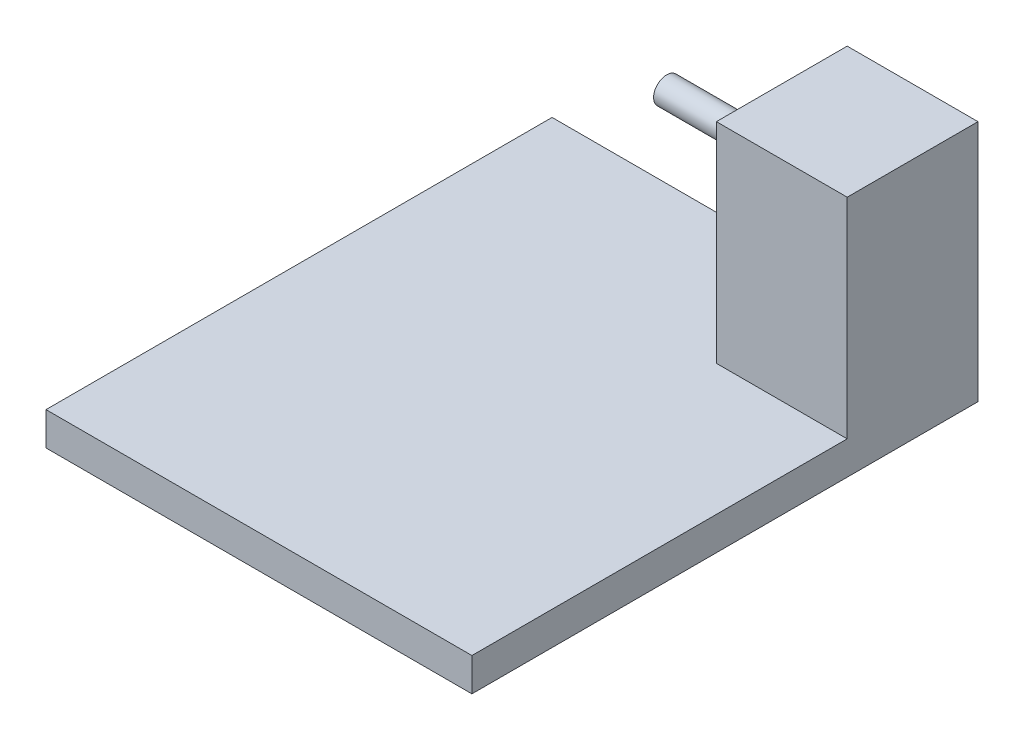
ISO-10303-21;
HEADER;
FILE_DESCRIPTION(('STEP AP214'),'2;1');
FILE_NAME('part.step','',(''),(''),'','','');
FILE_SCHEMA(('AUTOMOTIVE_DESIGN { 1 0 10303 214 1 1 1 1 }'));
ENDSEC;
DATA;
#1=APPLICATION_CONTEXT('core data for automotive mechanical design processes');
#2=APPLICATION_PROTOCOL_DEFINITION('international standard','automotive_design',2000,#1);
#3=PRODUCT_CONTEXT('',#1,'mechanical');
#4=PRODUCT('Part','Part','',(#3));
#5=PRODUCT_RELATED_PRODUCT_CATEGORY('part','',(#4));
#6=PRODUCT_DEFINITION_FORMATION('','',#4);
#7=PRODUCT_DEFINITION_CONTEXT('part definition',#1,'design');
#8=PRODUCT_DEFINITION('design','',#6,#7);
#9=PRODUCT_DEFINITION_SHAPE('','',#8);
#10=(LENGTH_UNIT() NAMED_UNIT(*) SI_UNIT(.MILLI.,.METRE.));
#11=(NAMED_UNIT(*) PLANE_ANGLE_UNIT() SI_UNIT($,.RADIAN.));
#12=(NAMED_UNIT(*) SI_UNIT($,.STERADIAN.) SOLID_ANGLE_UNIT());
#13=UNCERTAINTY_MEASURE_WITH_UNIT(LENGTH_MEASURE(1.E-05),#10,'distance_accuracy_value','');
#14=(GEOMETRIC_REPRESENTATION_CONTEXT(3) GLOBAL_UNCERTAINTY_ASSIGNED_CONTEXT((#13)) GLOBAL_UNIT_ASSIGNED_CONTEXT((#10,
#11,#12)) REPRESENTATION_CONTEXT('',''));
#15=CARTESIAN_POINT('',(0.,0.,0.));
#16=DIRECTION('',(0.,0.,1.));
#17=DIRECTION('',(1.,0.,0.));
#18=AXIS2_PLACEMENT_3D('',#15,#16,#17);
#19=CARTESIAN_POINT('',(40.7,6.35,-48.36));
#20=DIRECTION('',(-1.,0.,0.));
#21=DIRECTION('',(0.,0.,1.));
#22=AXIS2_PLACEMENT_3D('',#19,#20,#21);
#23=PLANE('',#22);
#24=DIRECTION('',(0.,0.,-1.));
#25=VECTOR('',#24,1.);
#26=CARTESIAN_POINT('',(40.7,0.,-48.36));
#27=LINE('',#26,#25);
#28=CARTESIAN_POINT('',(40.7,0.,48.36));
#29=VERTEX_POINT('',#28);
#30=CARTESIAN_POINT('',(40.7,0.,-48.36));
#31=VERTEX_POINT('',#30);
#32=EDGE_CURVE('E114',#29,#31,#27,.T.);
#33=ORIENTED_EDGE('',*,*,#32,.T.);
#34=DIRECTION('',(0.,-1.,0.));
#35=VECTOR('',#34,1.);
#36=CARTESIAN_POINT('',(40.7,6.35,-48.36));
#37=LINE('',#36,#35);
#38=CARTESIAN_POINT('',(40.7,46.35,-48.36));
#39=VERTEX_POINT('',#38);
#40=EDGE_CURVE('E40',#39,#31,#37,.T.);
#41=ORIENTED_EDGE('',*,*,#40,.F.);
#42=DIRECTION('',(0.,0.,-1.));
#43=VECTOR('',#42,1.);
#44=CARTESIAN_POINT('',(40.7,46.35,-48.36));
#45=LINE('',#44,#43);
#46=CARTESIAN_POINT('',(40.7,46.35,-23.36));
#47=VERTEX_POINT('',#46);
#48=EDGE_CURVE('E106',#47,#39,#45,.T.);
#49=ORIENTED_EDGE('',*,*,#48,.F.);
#50=DIRECTION('',(0.,-1.,0.));
#51=VECTOR('',#50,1.);
#52=CARTESIAN_POINT('',(40.7,46.35,-23.36));
#53=LINE('',#52,#51);
#54=CARTESIAN_POINT('',(40.7,6.35,-23.36));
#55=VERTEX_POINT('',#54);
#56=EDGE_CURVE('E119',#47,#55,#53,.T.);
#57=ORIENTED_EDGE('',*,*,#56,.T.);
#58=DIRECTION('',(0.,0.,-1.));
#59=VECTOR('',#58,1.);
#60=CARTESIAN_POINT('',(40.7,6.35,-48.36));
#61=LINE('',#60,#59);
#62=CARTESIAN_POINT('',(40.7,6.35,48.36));
#63=VERTEX_POINT('',#62);
#64=EDGE_CURVE('E53',#63,#55,#61,.T.);
#65=ORIENTED_EDGE('',*,*,#64,.F.);
#66=DIRECTION('',(0.,-1.,0.));
#67=VECTOR('',#66,1.);
#68=CARTESIAN_POINT('',(40.7,6.35,48.36));
#69=LINE('',#68,#67);
#70=EDGE_CURVE('E129',#63,#29,#69,.T.);
#71=ORIENTED_EDGE('',*,*,#70,.T.);
#72=EDGE_LOOP('',(#33,#41,#49,#57,#65,#71));
#73=FACE_BOUND('',#72,.T.);
#74=ADVANCED_FACE('F33',(#73),#23,.F.);
#75=CARTESIAN_POINT('',(-40.7,6.35,-48.36));
#76=DIRECTION('',(0.,0.,1.));
#77=DIRECTION('',(1.,0.,0.));
#78=AXIS2_PLACEMENT_3D('',#75,#76,#77);
#79=PLANE('',#78);
#80=DIRECTION('',(-1.,0.,0.));
#81=VECTOR('',#80,1.);
#82=CARTESIAN_POINT('',(-40.7,0.,-48.36));
#83=LINE('',#82,#81);
#84=CARTESIAN_POINT('',(-40.7,0.,-48.36));
#85=VERTEX_POINT('',#84);
#86=EDGE_CURVE('E117',#31,#85,#83,.T.);
#87=ORIENTED_EDGE('',*,*,#86,.T.);
#88=DIRECTION('',(0.,-1.,0.));
#89=VECTOR('',#88,1.);
#90=CARTESIAN_POINT('',(-40.7,6.35,-48.36));
#91=LINE('',#90,#89);
#92=CARTESIAN_POINT('',(-40.7,6.35,-48.36));
#93=VERTEX_POINT('',#92);
#94=EDGE_CURVE('E140',#93,#85,#91,.T.);
#95=ORIENTED_EDGE('',*,*,#94,.F.);
#96=DIRECTION('',(-1.,0.,0.));
#97=VECTOR('',#96,1.);
#98=CARTESIAN_POINT('',(-40.7,6.35,-48.36));
#99=LINE('',#98,#97);
#100=CARTESIAN_POINT('',(15.7,6.35,-48.36));
#101=VERTEX_POINT('',#100);
#102=EDGE_CURVE('E113',#101,#93,#99,.T.);
#103=ORIENTED_EDGE('',*,*,#102,.F.);
#104=DIRECTION('',(0.,-1.,0.));
#105=VECTOR('',#104,1.);
#106=CARTESIAN_POINT('',(15.7,46.35,-48.36));
#107=LINE('',#106,#105);
#108=CARTESIAN_POINT('',(15.7,46.35,-48.36));
#109=VERTEX_POINT('',#108);
#110=EDGE_CURVE('E94',#109,#101,#107,.T.);
#111=ORIENTED_EDGE('',*,*,#110,.F.);
#112=DIRECTION('',(-1.,0.,0.));
#113=VECTOR('',#112,1.);
#114=CARTESIAN_POINT('',(40.7,46.35,-48.36));
#115=LINE('',#114,#113);
#116=EDGE_CURVE('E100',#39,#109,#115,.T.);
#117=ORIENTED_EDGE('',*,*,#116,.F.);
#118=ORIENTED_EDGE('',*,*,#40,.T.);
#119=EDGE_LOOP('',(#87,#95,#103,#111,#117,#118));
#120=FACE_BOUND('',#119,.T.);
#121=ADVANCED_FACE('F111',(#120),#79,.F.);
#122=CARTESIAN_POINT('',(-40.7,6.35,-48.36));
#123=DIRECTION('',(1.,0.,0.));
#124=DIRECTION('',(0.,0.,-1.));
#125=AXIS2_PLACEMENT_3D('',#122,#123,#124);
#126=PLANE('',#125);
#127=DIRECTION('',(0.,0.,1.));
#128=VECTOR('',#127,1.);
#129=CARTESIAN_POINT('',(-40.7,0.,-48.36));
#130=LINE('',#129,#128);
#131=CARTESIAN_POINT('',(-40.7,0.,48.36));
#132=VERTEX_POINT('',#131);
#133=EDGE_CURVE('E132',#85,#132,#130,.T.);
#134=ORIENTED_EDGE('',*,*,#133,.T.);
#135=DIRECTION('',(0.,-1.,0.));
#136=VECTOR('',#135,1.);
#137=CARTESIAN_POINT('',(-40.7,6.35,48.36));
#138=LINE('',#137,#136);
#139=CARTESIAN_POINT('',(-40.7,6.35,48.36));
#140=VERTEX_POINT('',#139);
#141=EDGE_CURVE('E137',#140,#132,#138,.T.);
#142=ORIENTED_EDGE('',*,*,#141,.F.);
#143=DIRECTION('',(0.,0.,1.));
#144=VECTOR('',#143,1.);
#145=CARTESIAN_POINT('',(-40.7,6.35,-48.36));
#146=LINE('',#145,#144);
#147=EDGE_CURVE('E126',#93,#140,#146,.T.);
#148=ORIENTED_EDGE('',*,*,#147,.F.);
#149=ORIENTED_EDGE('',*,*,#94,.T.);
#150=EDGE_LOOP('',(#134,#142,#148,#149));
#151=FACE_BOUND('',#150,.T.);
#152=ADVANCED_FACE('F151',(#151),#126,.F.);
#153=CARTESIAN_POINT('',(-40.7,6.35,48.36));
#154=DIRECTION('',(0.,0.,-1.));
#155=DIRECTION('',(-1.,0.,0.));
#156=AXIS2_PLACEMENT_3D('',#153,#154,#155);
#157=PLANE('',#156);
#158=DIRECTION('',(1.,0.,0.));
#159=VECTOR('',#158,1.);
#160=CARTESIAN_POINT('',(-40.7,0.,48.36));
#161=LINE('',#160,#159);
#162=EDGE_CURVE('E124',#132,#29,#161,.T.);
#163=ORIENTED_EDGE('',*,*,#162,.T.);
#164=ORIENTED_EDGE('',*,*,#70,.F.);
#165=DIRECTION('',(1.,0.,0.));
#166=VECTOR('',#165,1.);
#167=CARTESIAN_POINT('',(-40.7,6.35,48.36));
#168=LINE('',#167,#166);
#169=EDGE_CURVE('E128',#140,#63,#168,.T.);
#170=ORIENTED_EDGE('',*,*,#169,.F.);
#171=ORIENTED_EDGE('',*,*,#141,.T.);
#172=EDGE_LOOP('',(#163,#164,#170,#171));
#173=FACE_BOUND('',#172,.T.);
#174=ADVANCED_FACE('F155',(#173),#157,.F.);
#175=CARTESIAN_POINT('',(0.,6.35,0.));
#176=DIRECTION('',(0.,1.,0.));
#177=DIRECTION('',(0.,0.,1.));
#178=AXIS2_PLACEMENT_3D('',#175,#176,#177);
#179=PLANE('',#178);
#180=DIRECTION('',(1.,0.,0.));
#181=VECTOR('',#180,1.);
#182=CARTESIAN_POINT('',(40.7,6.35,-23.36));
#183=LINE('',#182,#181);
#184=CARTESIAN_POINT('',(15.7,6.35,-23.36));
#185=VERTEX_POINT('',#184);
#186=EDGE_CURVE('E109',#185,#55,#183,.T.);
#187=ORIENTED_EDGE('',*,*,#186,.F.);
#188=DIRECTION('',(0.,0.,1.));
#189=VECTOR('',#188,1.);
#190=CARTESIAN_POINT('',(15.7,6.35,-48.36));
#191=LINE('',#190,#189);
#192=EDGE_CURVE('E47',#101,#185,#191,.T.);
#193=ORIENTED_EDGE('',*,*,#192,.F.);
#194=ORIENTED_EDGE('',*,*,#102,.T.);
#195=ORIENTED_EDGE('',*,*,#147,.T.);
#196=ORIENTED_EDGE('',*,*,#169,.T.);
#197=ORIENTED_EDGE('',*,*,#64,.T.);
#198=EDGE_LOOP('',(#187,#193,#194,#195,#196,#197));
#199=FACE_BOUND('',#198,.T.);
#200=ADVANCED_FACE('F156',(#199),#179,.T.);
#201=CARTESIAN_POINT('',(0.,0.,0.));
#202=DIRECTION('',(0.,1.,0.));
#203=DIRECTION('',(0.,0.,1.));
#204=AXIS2_PLACEMENT_3D('',#201,#202,#203);
#205=PLANE('',#204);
#206=ORIENTED_EDGE('',*,*,#32,.F.);
#207=ORIENTED_EDGE('',*,*,#162,.F.);
#208=ORIENTED_EDGE('',*,*,#133,.F.);
#209=ORIENTED_EDGE('',*,*,#86,.F.);
#210=EDGE_LOOP('',(#206,#207,#208,#209));
#211=FACE_BOUND('',#210,.T.);
#212=ADVANCED_FACE('F147',(#211),#205,.F.);
#213=CARTESIAN_POINT('',(15.7,46.35,-48.36));
#214=DIRECTION('',(1.,0.,0.));
#215=DIRECTION('',(0.,0.,-1.));
#216=AXIS2_PLACEMENT_3D('',#213,#214,#215);
#217=PLANE('',#216);
#218=CARTESIAN_POINT('',(15.7,34.35,-35.86));
#219=DIRECTION('',(1.,0.,0.));
#220=DIRECTION('',(0.,0.,-1.));
#221=AXIS2_PLACEMENT_3D('',#218,#219,#220);
#222=CIRCLE('',#221,2.5);
#223=CARTESIAN_POINT('',(15.7,34.35,-38.36));
#224=VERTEX_POINT('',#223);
#225=EDGE_CURVE('E11',#224,#224,#222,.F.);
#226=ORIENTED_EDGE('',*,*,#225,.F.);
#227=EDGE_LOOP('',(#226));
#228=FACE_BOUND('',#227,.T.);
#229=ORIENTED_EDGE('',*,*,#192,.T.);
#230=DIRECTION('',(0.,-1.,0.));
#231=VECTOR('',#230,1.);
#232=CARTESIAN_POINT('',(15.7,46.35,-23.36));
#233=LINE('',#232,#231);
#234=CARTESIAN_POINT('',(15.7,46.35,-23.36));
#235=VERTEX_POINT('',#234);
#236=EDGE_CURVE('E96',#235,#185,#233,.T.);
#237=ORIENTED_EDGE('',*,*,#236,.F.);
#238=DIRECTION('',(0.,0.,1.));
#239=VECTOR('',#238,1.);
#240=CARTESIAN_POINT('',(15.7,46.35,-48.36));
#241=LINE('',#240,#239);
#242=EDGE_CURVE('E90',#109,#235,#241,.T.);
#243=ORIENTED_EDGE('',*,*,#242,.F.);
#244=ORIENTED_EDGE('',*,*,#110,.T.);
#245=EDGE_LOOP('',(#229,#237,#243,#244));
#246=FACE_BOUND('',#245,.T.);
#247=ADVANCED_FACE('F92',(#228,#246),#217,.F.);
#248=CARTESIAN_POINT('',(40.7,46.35,-23.36));
#249=DIRECTION('',(0.,0.,-1.));
#250=DIRECTION('',(-1.,0.,0.));
#251=AXIS2_PLACEMENT_3D('',#248,#249,#250);
#252=PLANE('',#251);
#253=ORIENTED_EDGE('',*,*,#186,.T.);
#254=ORIENTED_EDGE('',*,*,#56,.F.);
#255=DIRECTION('',(1.,0.,0.));
#256=VECTOR('',#255,1.);
#257=CARTESIAN_POINT('',(40.7,46.35,-23.36));
#258=LINE('',#257,#256);
#259=EDGE_CURVE('E99',#235,#47,#258,.T.);
#260=ORIENTED_EDGE('',*,*,#259,.F.);
#261=ORIENTED_EDGE('',*,*,#236,.T.);
#262=EDGE_LOOP('',(#253,#254,#260,#261));
#263=FACE_BOUND('',#262,.T.);
#264=ADVANCED_FACE('F207',(#263),#252,.F.);
#265=CARTESIAN_POINT('',(0.,46.35,0.));
#266=DIRECTION('',(0.,1.,0.));
#267=DIRECTION('',(0.,0.,1.));
#268=AXIS2_PLACEMENT_3D('',#265,#266,#267);
#269=PLANE('',#268);
#270=ORIENTED_EDGE('',*,*,#116,.T.);
#271=ORIENTED_EDGE('',*,*,#242,.T.);
#272=ORIENTED_EDGE('',*,*,#259,.T.);
#273=ORIENTED_EDGE('',*,*,#48,.T.);
#274=EDGE_LOOP('',(#270,#271,#272,#273));
#275=FACE_BOUND('',#274,.T.);
#276=ADVANCED_FACE('F104',(#275),#269,.T.);
#277=CARTESIAN_POINT('',(-6.3,34.35,-35.86));
#278=DIRECTION('',(1.,0.,0.));
#279=DIRECTION('',(0.,0.,-1.));
#280=AXIS2_PLACEMENT_3D('',#277,#278,#279);
#281=CYLINDRICAL_SURFACE('',#280,2.5);
#282=CARTESIAN_POINT('',(-6.3,34.35,-35.86));
#283=DIRECTION('',(-1.,0.,0.));
#284=DIRECTION('',(0.,0.,1.));
#285=AXIS2_PLACEMENT_3D('',#282,#283,#284);
#286=CIRCLE('',#285,2.5);
#287=CARTESIAN_POINT('',(-6.3,34.35,-33.36));
#288=VERTEX_POINT('',#287);
#289=EDGE_CURVE('E252',#288,#288,#286,.T.);
#290=ORIENTED_EDGE('',*,*,#289,.F.);
#291=EDGE_LOOP('',(#290));
#292=FACE_BOUND('',#291,.T.);
#293=ORIENTED_EDGE('',*,*,#225,.T.);
#294=EDGE_LOOP('',(#293));
#295=FACE_BOUND('',#294,.T.);
#296=ADVANCED_FACE('F221',(#292,#295),#281,.T.);
#297=CARTESIAN_POINT('',(-6.3,34.35,-35.86));
#298=DIRECTION('',(-1.,0.,0.));
#299=DIRECTION('',(0.,0.,1.));
#300=AXIS2_PLACEMENT_3D('',#297,#298,#299);
#301=PLANE('',#300);
#302=ORIENTED_EDGE('',*,*,#289,.T.);
#303=EDGE_LOOP('',(#302));
#304=FACE_BOUND('',#303,.T.);
#305=ADVANCED_FACE('F236',(#304),#301,.T.);
#306=CLOSED_SHELL('',(#74,#121,#152,#174,#200,#212,#247,#264,#276,#296,#305));
#307=MANIFOLD_SOLID_BREP('B2',#306);
#308=ADVANCED_BREP_SHAPE_REPRESENTATION('',(#18,#307),#14);
#309=SHAPE_DEFINITION_REPRESENTATION(#9,#308);
ENDSEC;
END-ISO-10303-21;
